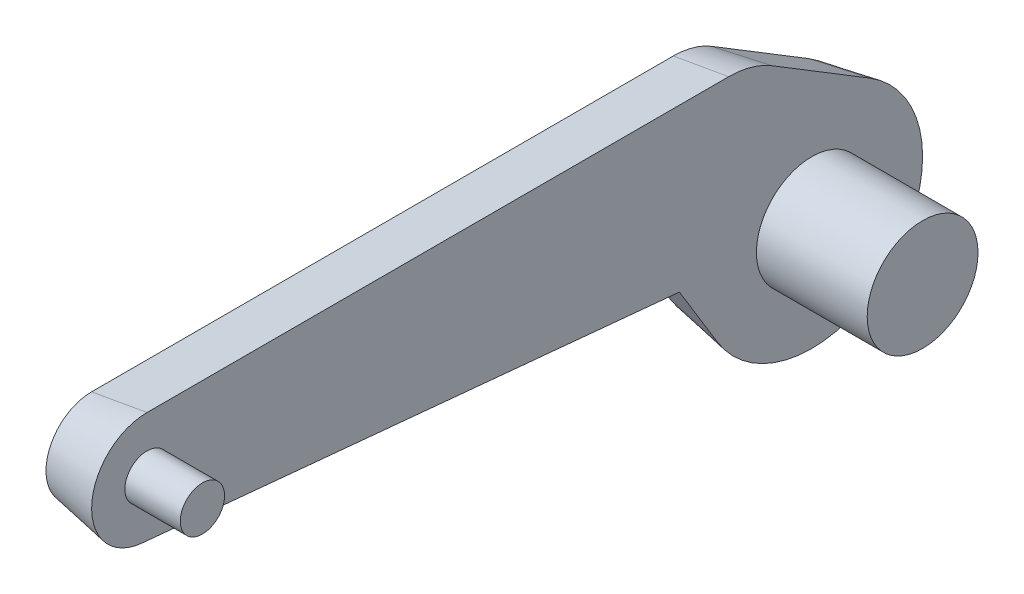
ISO-10303-21;
HEADER;
FILE_DESCRIPTION(('STEP AP214'),'2;1');
FILE_NAME('part.step','',(''),(''),'','','');
FILE_SCHEMA(('AUTOMOTIVE_DESIGN { 1 0 10303 214 1 1 1 1 }'));
ENDSEC;
DATA;
#1=APPLICATION_CONTEXT('core data for automotive mechanical design processes');
#2=APPLICATION_PROTOCOL_DEFINITION('international standard','automotive_design',2000,#1);
#3=PRODUCT_CONTEXT('',#1,'mechanical');
#4=PRODUCT('Part','Part','',(#3));
#5=PRODUCT_RELATED_PRODUCT_CATEGORY('part','',(#4));
#6=PRODUCT_DEFINITION_FORMATION('','',#4);
#7=PRODUCT_DEFINITION_CONTEXT('part definition',#1,'design');
#8=PRODUCT_DEFINITION('design','',#6,#7);
#9=PRODUCT_DEFINITION_SHAPE('','',#8);
#10=(LENGTH_UNIT() NAMED_UNIT(*) SI_UNIT(.MILLI.,.METRE.));
#11=(NAMED_UNIT(*) PLANE_ANGLE_UNIT() SI_UNIT($,.RADIAN.));
#12=(NAMED_UNIT(*) SI_UNIT($,.STERADIAN.) SOLID_ANGLE_UNIT());
#13=UNCERTAINTY_MEASURE_WITH_UNIT(LENGTH_MEASURE(1.E-05),#10,'distance_accuracy_value','');
#14=(GEOMETRIC_REPRESENTATION_CONTEXT(3) GLOBAL_UNCERTAINTY_ASSIGNED_CONTEXT((#13)) GLOBAL_UNIT_ASSIGNED_CONTEXT((#10,
#11,#12)) REPRESENTATION_CONTEXT('',''));
#15=CARTESIAN_POINT('',(0.,0.,0.));
#16=DIRECTION('',(0.,0.,1.));
#17=DIRECTION('',(1.,0.,0.));
#18=AXIS2_PLACEMENT_3D('',#15,#16,#17);
#19=CARTESIAN_POINT('',(-250.,-2771.52042587515,1307.45269851304));
#20=DIRECTION('',(-1.,0.,0.));
#21=DIRECTION('',(0.,0.,1.));
#22=AXIS2_PLACEMENT_3D('',#19,#20,#21);
#23=PLANE('',#22);
#24=CARTESIAN_POINT('',(-250.,0.,0.));
#25=DIRECTION('',(-1.,0.,0.));
#26=DIRECTION('',(0.,0.,1.));
#27=AXIS2_PLACEMENT_3D('',#24,#25,#26);
#28=CIRCLE('',#27,250.);
#29=CARTESIAN_POINT('',(-250.,0.,250.));
#30=VERTEX_POINT('',#29);
#31=EDGE_CURVE('E105',#30,#30,#28,.T.);
#32=ORIENTED_EDGE('',*,*,#31,.T.);
#33=EDGE_LOOP('',(#32));
#34=FACE_BOUND('',#33,.T.);
#35=DIRECTION('',(0.,0.520517604269607,0.853850937602946));
#36=VECTOR('',#35,1.);
#37=CARTESIAN_POINT('',(-250.,257.10375850526,-538.832332352336));
#38=LINE('',#37,#36);
#39=CARTESIAN_POINT('',(-250.,426.925468801473,-260.258802134804));
#40=VERTEX_POINT('',#39);
#41=CARTESIAN_POINT('',(-250.,695.194101601105,179.805898398902));
#42=VERTEX_POINT('',#41);
#43=EDGE_CURVE('E113',#40,#42,#38,.T.);
#44=ORIENTED_EDGE('',*,*,#43,.T.);
#45=CARTESIAN_POINT('',(-250.,375.000000000001,375.000000000005));
#46=DIRECTION('',(-1.,0.,0.));
#47=DIRECTION('',(0.,0.,1.));
#48=AXIS2_PLACEMENT_3D('',#45,#46,#47);
#49=CIRCLE('',#48,375.);
#50=CARTESIAN_POINT('',(-250.,750.000000000001,375.000000000005));
#51=VERTEX_POINT('',#50);
#52=EDGE_CURVE('E134',#51,#42,#49,.T.);
#53=ORIENTED_EDGE('',*,*,#52,.F.);
#54=DIRECTION('',(0.,0.,1.));
#55=VECTOR('',#54,1.);
#56=CARTESIAN_POINT('',(-250.,750.000000000001,1307.45269851304));
#57=LINE('',#56,#55);
#58=CARTESIAN_POINT('',(-250.,750.000000000001,3000.));
#59=VERTEX_POINT('',#58);
#60=EDGE_CURVE('E131',#51,#59,#57,.T.);
#61=ORIENTED_EDGE('',*,*,#60,.T.);
#62=CARTESIAN_POINT('',(-250.,500.000000000001,3000.));
#63=DIRECTION('',(-1.,0.,0.));
#64=DIRECTION('',(0.,0.,1.));
#65=AXIS2_PLACEMENT_3D('',#62,#63,#64);
#66=CIRCLE('',#65,250.);
#67=CARTESIAN_POINT('',(-250.,251.131221719458,3023.7556561086));
#68=VERTEX_POINT('',#67);
#69=EDGE_CURVE('E128',#68,#59,#66,.T.);
#70=ORIENTED_EDGE('',*,*,#69,.F.);
#71=DIRECTION('',(0.,0.0950226244343894,0.995475113122172));
#72=VECTOR('',#71,1.);
#73=CARTESIAN_POINT('',(-250.,61.4891373911126,1037.02905838308));
#74=LINE('',#73,#72);
#75=CARTESIAN_POINT('',(-250.,19.5331297918602,597.489931152814));
#76=VERTEX_POINT('',#75);
#77=EDGE_CURVE('E126',#76,#68,#74,.T.);
#78=ORIENTED_EDGE('',*,*,#77,.F.);
#79=DIRECTION('',(0.,0.85385093760294,0.520517604269616));
#80=VECTOR('',#79,1.);
#81=CARTESIAN_POINT('',(-250.,-1699.77734125769,-450.622014356973));
#82=LINE('',#81,#80);
#83=CARTESIAN_POINT('',(-250.,-260.258802134808,426.92546880147));
#84=VERTEX_POINT('',#83);
#85=EDGE_CURVE('E115',#84,#76,#82,.T.);
#86=ORIENTED_EDGE('',*,*,#85,.F.);
#87=CARTESIAN_POINT('',(-250.,0.,0.));
#88=DIRECTION('',(-1.,0.,0.));
#89=DIRECTION('',(0.,0.,1.));
#90=AXIS2_PLACEMENT_3D('',#87,#88,#89);
#91=CIRCLE('',#90,500.);
#92=EDGE_CURVE('E99',#40,#84,#91,.T.);
#93=ORIENTED_EDGE('',*,*,#92,.F.);
#94=EDGE_LOOP('',(#44,#53,#61,#70,#78,#86,#93));
#95=FACE_BOUND('',#94,.T.);
#96=CARTESIAN_POINT('',(-250.,500.000000000001,3000.));
#97=DIRECTION('',(-1.,0.,0.));
#98=DIRECTION('',(0.,0.,1.));
#99=AXIS2_PLACEMENT_3D('',#96,#97,#98);
#100=CIRCLE('',#99,100.);
#101=CARTESIAN_POINT('',(-250.,500.000000000001,3100.));
#102=VERTEX_POINT('',#101);
#103=EDGE_CURVE('E11',#102,#102,#100,.F.);
#104=ORIENTED_EDGE('',*,*,#103,.F.);
#105=EDGE_LOOP('',(#104));
#106=FACE_BOUND('',#105,.T.);
#107=ADVANCED_FACE('F35',(#34,#95,#106),#23,.F.);
#108=CARTESIAN_POINT('',(250.,0.,0.));
#109=DIRECTION('',(-1.,0.,0.));
#110=DIRECTION('',(0.,0.,1.));
#111=AXIS2_PLACEMENT_3D('',#108,#109,#110);
#112=CYLINDRICAL_SURFACE('',#111,250.);
#113=CARTESIAN_POINT('',(250.,0.,0.));
#114=DIRECTION('',(1.,0.,0.));
#115=DIRECTION('',(0.,0.,-1.));
#116=AXIS2_PLACEMENT_3D('',#113,#114,#115);
#117=CIRCLE('',#116,250.);
#118=CARTESIAN_POINT('',(250.,0.,-250.));
#119=VERTEX_POINT('',#118);
#120=EDGE_CURVE('E43',#119,#119,#117,.T.);
#121=ORIENTED_EDGE('',*,*,#120,.F.);
#122=EDGE_LOOP('',(#121));
#123=FACE_BOUND('',#122,.T.);
#124=ORIENTED_EDGE('',*,*,#31,.F.);
#125=EDGE_LOOP('',(#124));
#126=FACE_BOUND('',#125,.T.);
#127=ADVANCED_FACE('F37',(#123,#126),#112,.T.);
#128=CARTESIAN_POINT('',(250.,0.,0.));
#129=DIRECTION('',(1.,0.,0.));
#130=DIRECTION('',(0.,0.,-1.));
#131=AXIS2_PLACEMENT_3D('',#128,#129,#130);
#132=PLANE('',#131);
#133=ORIENTED_EDGE('',*,*,#120,.T.);
#134=EDGE_LOOP('',(#133));
#135=FACE_BOUND('',#134,.T.);
#136=ADVANCED_FACE('F163',(#135),#132,.T.);
#137=CARTESIAN_POINT('',(-250.,257.10375850526,-538.832332352336));
#138=DIRECTION('',(-0.173648177666931,0.840879023268124,-0.512609772264049));
#139=DIRECTION('',(0.,0.520517604269607,0.853850937602946));
#140=AXIS2_PLACEMENT_3D('',#137,#138,#139);
#141=PLANE('',#140);
#142=ORIENTED_EDGE('',*,*,#43,.F.);
#143=DIRECTION('',(0.984807753012208,0.148269659313952,-0.0903869334249738));
#144=VECTOR('',#143,1.);
#145=CARTESIAN_POINT('',(-250.,426.925468801473,-260.258802134803));
#146=LINE('',#145,#144);
#147=CARTESIAN_POINT('',(-500.,389.286229350818,-237.313477743188));
#148=VERTEX_POINT('',#147);
#149=EDGE_CURVE('E95',#148,#40,#146,.T.);
#150=ORIENTED_EDGE('',*,*,#149,.F.);
#151=DIRECTION('',(0.,0.520517604269607,0.853850937602946));
#152=VECTOR('',#151,1.);
#153=CARTESIAN_POINT('',(-500.,219.464519054605,-515.88700796072));
#154=LINE('',#153,#152);
#155=CARTESIAN_POINT('',(-500.,657.55486215045,202.751222790518));
#156=VERTEX_POINT('',#155);
#157=EDGE_CURVE('E135',#148,#156,#154,.T.);
#158=ORIENTED_EDGE('',*,*,#157,.T.);
#159=DIRECTION('',(0.984807753012208,0.148269659313952,-0.0903869334249738));
#160=VECTOR('',#159,1.);
#161=CARTESIAN_POINT('',(-250.,695.194101601105,179.805898398902));
#162=LINE('',#161,#160);
#163=EDGE_CURVE('E118',#156,#42,#162,.T.);
#164=ORIENTED_EDGE('',*,*,#163,.T.);
#165=EDGE_LOOP('',(#142,#150,#158,#164));
#166=FACE_BOUND('',#165,.T.);
#167=ADVANCED_FACE('F117',(#166),#141,.T.);
#168=CARTESIAN_POINT('',(-250.,0.,0.));
#169=DIRECTION('',(1.,0.,0.));
#170=DIRECTION('',(0.,0.,1.));
#171=AXIS2_PLACEMENT_3D('',#168,#169,#170);
#172=CONICAL_SURFACE('',#171,500.,0.174532925199433);
#173=ORIENTED_EDGE('',*,*,#92,.T.);
#174=DIRECTION('',(0.984807753012208,-0.0903869334249753,0.148269659313951));
#175=VECTOR('',#174,1.);
#176=CARTESIAN_POINT('',(-250.,-260.258802134808,426.92546880147));
#177=LINE('',#176,#175);
#178=CARTESIAN_POINT('',(-500.,-237.313477743191,389.286229350815));
#179=VERTEX_POINT('',#178);
#180=EDGE_CURVE('E106',#179,#84,#177,.T.);
#181=ORIENTED_EDGE('',*,*,#180,.F.);
#182=CARTESIAN_POINT('',(-500.,0.,0.));
#183=DIRECTION('',(-1.,0.,0.));
#184=DIRECTION('',(0.,0.,1.));
#185=AXIS2_PLACEMENT_3D('',#182,#183,#184);
#186=CIRCLE('',#185,455.918254822884);
#187=EDGE_CURVE('E101',#148,#179,#186,.T.);
#188=ORIENTED_EDGE('',*,*,#187,.F.);
#189=ORIENTED_EDGE('',*,*,#149,.T.);
#190=EDGE_LOOP('',(#173,#181,#188,#189));
#191=FACE_BOUND('',#190,.T.);
#192=ADVANCED_FACE('F97',(#191),#172,.T.);
#193=CARTESIAN_POINT('',(-250.,-1699.77734125769,-450.622014356973));
#194=DIRECTION('',(-0.173648177666931,-0.512609772264058,0.840879023268119));
#195=DIRECTION('',(0.,-0.85385093760294,-0.520517604269615));
#196=AXIS2_PLACEMENT_3D('',#193,#194,#195);
#197=PLANE('',#196);
#198=ORIENTED_EDGE('',*,*,#85,.T.);
#199=DIRECTION('',(0.981108599004363,-0.16398484580846,0.102639599107126));
#200=VECTOR('',#199,1.);
#201=CARTESIAN_POINT('',(-78.9308901376261,-9.05977178074879,615.386487022068));
#202=LINE('',#201,#200);
#203=CARTESIAN_POINT('',(-500.,61.3187297689863,571.335945954007));
#204=VERTEX_POINT('',#203);
#205=EDGE_CURVE('E144',#204,#76,#202,.T.);
#206=ORIENTED_EDGE('',*,*,#205,.F.);
#207=DIRECTION('',(0.,-0.85385093760294,-0.520517604269615));
#208=VECTOR('',#207,1.);
#209=CARTESIAN_POINT('',(-500.,-1676.83201686607,-488.261253807628));
#210=LINE('',#209,#208);
#211=EDGE_CURVE('E150',#179,#204,#210,.F.);
#212=ORIENTED_EDGE('',*,*,#211,.F.);
#213=ORIENTED_EDGE('',*,*,#180,.T.);
#214=EDGE_LOOP('',(#198,#206,#212,#213));
#215=FACE_BOUND('',#214,.T.);
#216=ADVANCED_FACE('F193',(#215),#197,.T.);
#217=CARTESIAN_POINT('',(-250.,61.4891373911126,1037.02905838308));
#218=DIRECTION('',(-0.173648177666931,-0.98035160933342,0.0935790172545539));
#219=DIRECTION('',(0.984672494168187,-0.174413529373729,0.));
#220=AXIS2_PLACEMENT_3D('',#217,#218,#219);
#221=PLANE('',#220);
#222=ORIENTED_EDGE('',*,*,#77,.T.);
#223=DIRECTION('',(0.984807753012208,-0.172862439306447,0.0165005055701608));
#224=VECTOR('',#223,1.);
#225=CARTESIAN_POINT('',(-250.,251.131221719458,3023.7556561086));
#226=LINE('',#225,#224);
#227=CARTESIAN_POINT('',(-500.,295.013501986271,3019.56689299222));
#228=VERTEX_POINT('',#227);
#229=EDGE_CURVE('E141',#228,#68,#226,.T.);
#230=ORIENTED_EDGE('',*,*,#229,.F.);
#231=DIRECTION('',(0.,-0.0950226244343893,-0.995475113122172));
#232=VECTOR('',#231,1.);
#233=CARTESIAN_POINT('',(-500.,105.371417657925,1032.8402952667));
#234=LINE('',#233,#232);
#235=EDGE_CURVE('E152',#204,#228,#234,.F.);
#236=ORIENTED_EDGE('',*,*,#235,.F.);
#237=ORIENTED_EDGE('',*,*,#205,.T.);
#238=EDGE_LOOP('',(#222,#230,#236,#237));
#239=FACE_BOUND('',#238,.T.);
#240=ADVANCED_FACE('F189',(#239),#221,.T.);
#241=CARTESIAN_POINT('',(-250.,500.000000000001,3000.));
#242=DIRECTION('',(1.,0.,0.));
#243=DIRECTION('',(0.,0.,1.));
#244=AXIS2_PLACEMENT_3D('',#241,#242,#243);
#245=CONICAL_SURFACE('',#244,250.,0.174532925199433);
#246=ORIENTED_EDGE('',*,*,#69,.T.);
#247=DIRECTION('',(0.984807753012208,0.173648177666931,0.));
#248=VECTOR('',#247,1.);
#249=CARTESIAN_POINT('',(-250.,750.000000000001,3000.));
#250=LINE('',#249,#248);
#251=CARTESIAN_POINT('',(-500.,705.918254822884,3000.));
#252=VERTEX_POINT('',#251);
#253=EDGE_CURVE('E139',#252,#59,#250,.T.);
#254=ORIENTED_EDGE('',*,*,#253,.F.);
#255=CARTESIAN_POINT('',(-500.,500.000000000001,3000.));
#256=DIRECTION('',(-1.,0.,0.));
#257=DIRECTION('',(0.,0.,1.));
#258=AXIS2_PLACEMENT_3D('',#255,#256,#257);
#259=CIRCLE('',#258,205.918254822883);
#260=EDGE_CURVE('E154',#228,#252,#259,.T.);
#261=ORIENTED_EDGE('',*,*,#260,.F.);
#262=ORIENTED_EDGE('',*,*,#229,.T.);
#263=EDGE_LOOP('',(#246,#254,#261,#262));
#264=FACE_BOUND('',#263,.T.);
#265=ADVANCED_FACE('F186',(#264),#245,.T.);
#266=CARTESIAN_POINT('',(-250.,750.000000000001,1307.45269851304));
#267=DIRECTION('',(-0.173648177666931,0.984807753012208,0.));
#268=DIRECTION('',(-0.984807753012208,-0.173648177666931,0.));
#269=AXIS2_PLACEMENT_3D('',#266,#267,#268);
#270=PLANE('',#269);
#271=ORIENTED_EDGE('',*,*,#60,.F.);
#272=DIRECTION('',(0.984807753012208,0.173648177666931,0.));
#273=VECTOR('',#272,1.);
#274=CARTESIAN_POINT('',(-250.,750.000000000001,375.000000000005));
#275=LINE('',#274,#273);
#276=CARTESIAN_POINT('',(-500.,705.918254822884,375.000000000005));
#277=VERTEX_POINT('',#276);
#278=EDGE_CURVE('E58',#277,#51,#275,.T.);
#279=ORIENTED_EDGE('',*,*,#278,.F.);
#280=DIRECTION('',(0.,0.,1.));
#281=VECTOR('',#280,1.);
#282=CARTESIAN_POINT('',(-500.,705.918254822884,1307.45269851304));
#283=LINE('',#282,#281);
#284=EDGE_CURVE('E156',#277,#252,#283,.T.);
#285=ORIENTED_EDGE('',*,*,#284,.T.);
#286=ORIENTED_EDGE('',*,*,#253,.T.);
#287=EDGE_LOOP('',(#271,#279,#285,#286));
#288=FACE_BOUND('',#287,.T.);
#289=ADVANCED_FACE('F182',(#288),#270,.T.);
#290=CARTESIAN_POINT('',(-250.,375.000000000001,375.000000000005));
#291=DIRECTION('',(1.,0.,0.));
#292=DIRECTION('',(0.,0.,1.));
#293=AXIS2_PLACEMENT_3D('',#290,#291,#292);
#294=CONICAL_SURFACE('',#293,375.,0.174532925199433);
#295=ORIENTED_EDGE('',*,*,#52,.T.);
#296=ORIENTED_EDGE('',*,*,#163,.F.);
#297=CARTESIAN_POINT('',(-500.,375.000000000001,375.000000000005));
#298=DIRECTION('',(-1.,0.,0.));
#299=DIRECTION('',(0.,0.,1.));
#300=AXIS2_PLACEMENT_3D('',#297,#298,#299);
#301=CIRCLE('',#300,330.918254822884);
#302=EDGE_CURVE('E50',#277,#156,#301,.T.);
#303=ORIENTED_EDGE('',*,*,#302,.F.);
#304=ORIENTED_EDGE('',*,*,#278,.T.);
#305=EDGE_LOOP('',(#295,#296,#303,#304));
#306=FACE_BOUND('',#305,.T.);
#307=ADVANCED_FACE('F179',(#306),#294,.T.);
#308=CARTESIAN_POINT('',(-500.,-2771.52042587515,1307.45269851304));
#309=DIRECTION('',(-1.,0.,0.));
#310=DIRECTION('',(0.,0.,1.));
#311=AXIS2_PLACEMENT_3D('',#308,#309,#310);
#312=PLANE('',#311);
#313=ORIENTED_EDGE('',*,*,#157,.F.);
#314=ORIENTED_EDGE('',*,*,#187,.T.);
#315=ORIENTED_EDGE('',*,*,#211,.T.);
#316=ORIENTED_EDGE('',*,*,#235,.T.);
#317=ORIENTED_EDGE('',*,*,#260,.T.);
#318=ORIENTED_EDGE('',*,*,#284,.F.);
#319=ORIENTED_EDGE('',*,*,#302,.T.);
#320=EDGE_LOOP('',(#313,#314,#315,#316,#317,#318,#319));
#321=FACE_BOUND('',#320,.T.);
#322=ADVANCED_FACE('F175',(#321),#312,.T.);
#323=CARTESIAN_POINT('',(0.,500.000000000001,3000.));
#324=DIRECTION('',(-1.,0.,0.));
#325=DIRECTION('',(0.,0.,1.));
#326=AXIS2_PLACEMENT_3D('',#323,#324,#325);
#327=CYLINDRICAL_SURFACE('',#326,100.);
#328=CARTESIAN_POINT('',(0.,500.000000000001,3000.));
#329=DIRECTION('',(1.,0.,0.));
#330=DIRECTION('',(0.,0.,-1.));
#331=AXIS2_PLACEMENT_3D('',#328,#329,#330);
#332=CIRCLE('',#331,100.);
#333=CARTESIAN_POINT('',(0.,500.000000000001,2900.));
#334=VERTEX_POINT('',#333);
#335=EDGE_CURVE('E120',#334,#334,#332,.T.);
#336=ORIENTED_EDGE('',*,*,#335,.F.);
#337=EDGE_LOOP('',(#336));
#338=FACE_BOUND('',#337,.T.);
#339=ORIENTED_EDGE('',*,*,#103,.T.);
#340=EDGE_LOOP('',(#339));
#341=FACE_BOUND('',#340,.T.);
#342=ADVANCED_FACE('F238',(#338,#341),#327,.T.);
#343=CARTESIAN_POINT('',(0.,500.000000000001,3000.));
#344=DIRECTION('',(1.,0.,0.));
#345=DIRECTION('',(0.,0.,-1.));
#346=AXIS2_PLACEMENT_3D('',#343,#344,#345);
#347=PLANE('',#346);
#348=ORIENTED_EDGE('',*,*,#335,.T.);
#349=EDGE_LOOP('',(#348));
#350=FACE_BOUND('',#349,.T.);
#351=ADVANCED_FACE('F244',(#350),#347,.T.);
#352=CLOSED_SHELL('',(#107,#127,#136,#167,#192,#216,#240,#265,#289,#307,#322,#342,#351));
#353=MANIFOLD_SOLID_BREP('B2',#352);
#354=ADVANCED_BREP_SHAPE_REPRESENTATION('',(#18,#353),#14);
#355=SHAPE_DEFINITION_REPRESENTATION(#9,#354);
ENDSEC;
END-ISO-10303-21;
